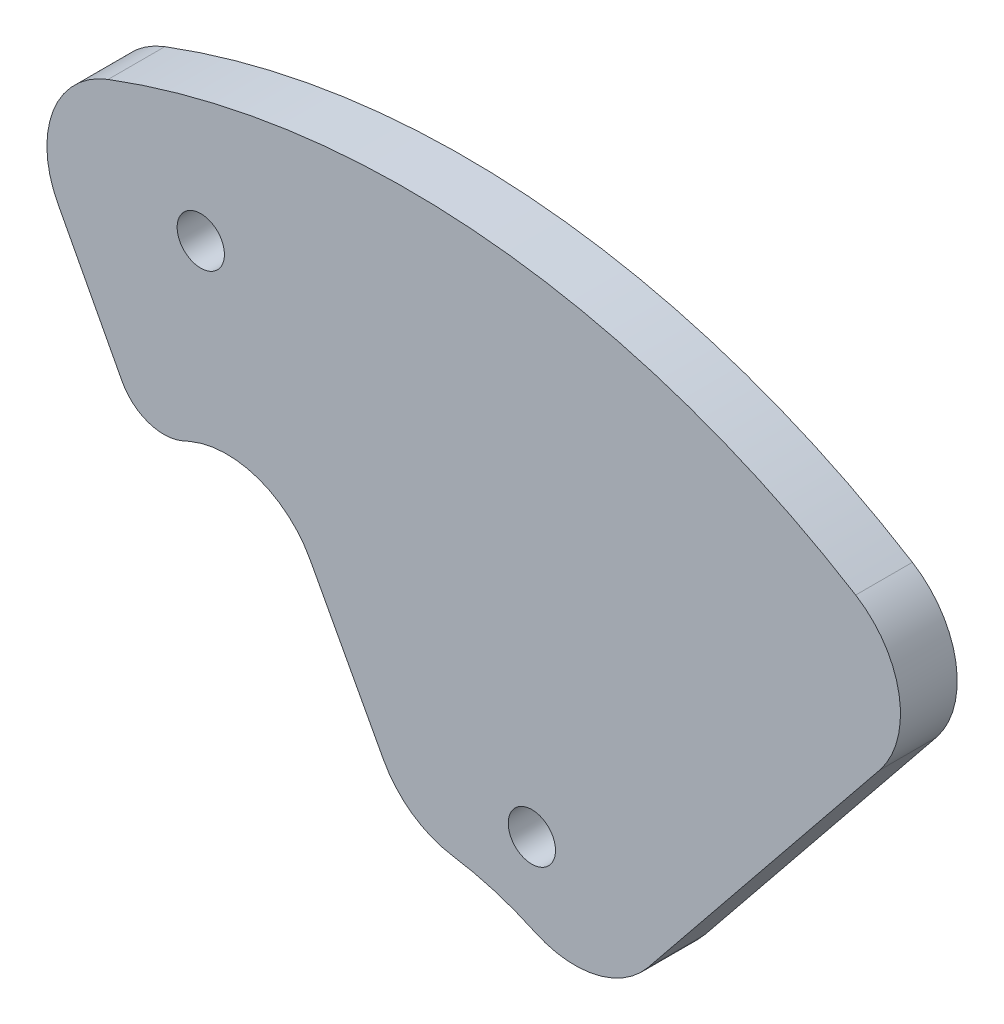
ISO-10303-21;
HEADER;
FILE_DESCRIPTION(('STEP AP214'),'2;1');
FILE_NAME('part.step','',(''),(''),'','','');
FILE_SCHEMA(('AUTOMOTIVE_DESIGN { 1 0 10303 214 1 1 1 1 }'));
ENDSEC;
DATA;
#1=APPLICATION_CONTEXT('core data for automotive mechanical design processes');
#2=APPLICATION_PROTOCOL_DEFINITION('international standard','automotive_design',2000,#1);
#3=PRODUCT_CONTEXT('',#1,'mechanical');
#4=PRODUCT('Part','Part','',(#3));
#5=PRODUCT_RELATED_PRODUCT_CATEGORY('part','',(#4));
#6=PRODUCT_DEFINITION_FORMATION('','',#4);
#7=PRODUCT_DEFINITION_CONTEXT('part definition',#1,'design');
#8=PRODUCT_DEFINITION('design','',#6,#7);
#9=PRODUCT_DEFINITION_SHAPE('','',#8);
#10=(LENGTH_UNIT() NAMED_UNIT(*) SI_UNIT(.MILLI.,.METRE.));
#11=(NAMED_UNIT(*) PLANE_ANGLE_UNIT() SI_UNIT($,.RADIAN.));
#12=(NAMED_UNIT(*) SI_UNIT($,.STERADIAN.) SOLID_ANGLE_UNIT());
#13=UNCERTAINTY_MEASURE_WITH_UNIT(LENGTH_MEASURE(1.E-05),#10,'distance_accuracy_value','');
#14=(GEOMETRIC_REPRESENTATION_CONTEXT(3) GLOBAL_UNCERTAINTY_ASSIGNED_CONTEXT((#13)) GLOBAL_UNIT_ASSIGNED_CONTEXT((#10,
#11,#12)) REPRESENTATION_CONTEXT('',''));
#15=CARTESIAN_POINT('',(0.,0.,0.));
#16=DIRECTION('',(0.,0.,1.));
#17=DIRECTION('',(1.,0.,0.));
#18=AXIS2_PLACEMENT_3D('',#15,#16,#17);
#19=CARTESIAN_POINT('',(42.096669339445,68.0284530951971,6.));
#20=DIRECTION('',(0.,0.,1.));
#21=DIRECTION('',(1.,0.,0.));
#22=AXIS2_PLACEMENT_3D('',#19,#20,#21);
#23=PLANE('',#22);
#24=CARTESIAN_POINT('',(13.1117963041511,37.2603112933648,6.));
#25=DIRECTION('',(0.,0.,1.));
#26=DIRECTION('',(1.,0.,0.));
#27=AXIS2_PLACEMENT_3D('',#24,#25,#26);
#28=CIRCLE('',#27,2.5);
#29=CARTESIAN_POINT('',(15.6117963041511,37.2603112933648,6.));
#30=VERTEX_POINT('',#29);
#31=EDGE_CURVE('E157',#30,#30,#28,.T.);
#32=ORIENTED_EDGE('',*,*,#31,.F.);
#33=EDGE_LOOP('',(#32));
#34=FACE_BOUND('',#33,.T.);
#35=DIRECTION('',(0.628375636537599,0.777910058686714,0.));
#36=VECTOR('',#35,1.);
#37=CARTESIAN_POINT('',(30.097916288786,37.2603112933648,6.));
#38=LINE('',#37,#36);
#39=CARTESIAN_POINT('',(25.4315486694119,31.4834891227238,6.));
#40=VERTEX_POINT('',#39);
#41=CARTESIAN_POINT('',(49.8757699263121,61.7446967298211,6.));
#42=VERTEX_POINT('',#41);
#43=EDGE_CURVE('E50',#40,#42,#38,.T.);
#44=ORIENTED_EDGE('',*,*,#43,.T.);
#45=CARTESIAN_POINT('',(42.096669339445,68.0284530951971,6.));
#46=DIRECTION('',(0.,0.,1.));
#47=DIRECTION('',(1.,0.,0.));
#48=AXIS2_PLACEMENT_3D('',#45,#46,#47);
#49=CIRCLE('',#48,9.99999999999999);
#50=CARTESIAN_POINT('',(47.3587530068756,76.5320097320967,6.));
#51=VERTEX_POINT('',#50);
#52=EDGE_CURVE('E245',#42,#51,#49,.T.);
#53=ORIENTED_EDGE('',*,*,#52,.T.);
#54=CARTESIAN_POINT('',(0.,0.,6.));
#55=DIRECTION('',(0.,0.,1.));
#56=DIRECTION('',(-1.,0.,0.));
#57=AXIS2_PLACEMENT_3D('',#54,#55,#56);
#58=CIRCLE('',#57,90.);
#59=CARTESIAN_POINT('',(-31.6999183212875,84.2325066611679,6.));
#60=VERTEX_POINT('',#59);
#61=EDGE_CURVE('E203',#51,#60,#58,.T.);
#62=ORIENTED_EDGE('',*,*,#61,.T.);
#63=CARTESIAN_POINT('',(-28.1777051744778,74.8733392543715,6.));
#64=DIRECTION('',(0.,0.,1.));
#65=DIRECTION('',(-1.,0.,0.));
#66=AXIS2_PLACEMENT_3D('',#63,#64,#65);
#67=CIRCLE('',#66,9.99999999999999);
#68=CARTESIAN_POINT('',(-37.0231895700033,70.2088558093892,6.));
#69=VERTEX_POINT('',#68);
#70=EDGE_CURVE('E225',#60,#69,#67,.T.);
#71=ORIENTED_EDGE('',*,*,#70,.T.);
#72=DIRECTION('',(0.466448344498234,-0.884548439552553,0.));
#73=VECTOR('',#72,1.);
#74=CARTESIAN_POINT('',(-37.0231895700033,70.2088558093892,6.));
#75=LINE('',#74,#73);
#76=CARTESIAN_POINT('',(-30.2293076989468,57.325290719214,6.));
#77=VERTEX_POINT('',#76);
#78=EDGE_CURVE('E222',#69,#77,#75,.T.);
#79=ORIENTED_EDGE('',*,*,#78,.T.);
#80=CARTESIAN_POINT('',(-25.806565501184,59.6575324417052,6.));
#81=DIRECTION('',(0.,0.,1.));
#82=DIRECTION('',(1.,0.,0.));
#83=AXIS2_PLACEMENT_3D('',#80,#81,#82);
#84=CIRCLE('',#83,5.);
#85=CARTESIAN_POINT('',(-23.821445078016,55.0684914846509,6.));
#86=VERTEX_POINT('',#85);
#87=EDGE_CURVE('E224',#77,#86,#84,.T.);
#88=ORIENTED_EDGE('',*,*,#87,.T.);
#89=CARTESIAN_POINT('',(0.,0.,6.));
#90=DIRECTION('',(0.,0.,-1.));
#91=DIRECTION('',(1.,0.,0.));
#92=AXIS2_PLACEMENT_3D('',#89,#90,#91);
#93=CIRCLE('',#92,60.);
#94=CARTESIAN_POINT('',(-22.9772998706753,55.4260199784638,6.));
#95=VERTEX_POINT('',#94);
#96=EDGE_CURVE('E227',#86,#95,#93,.T.);
#97=ORIENTED_EDGE('',*,*,#96,.T.);
#98=CARTESIAN_POINT('',(-19.1477498922294,46.1883499820531,6.));
#99=DIRECTION('',(0.,0.,-1.));
#100=DIRECTION('',(1.,0.,0.));
#101=AXIS2_PLACEMENT_3D('',#98,#99,#100);
#102=CIRCLE('',#101,10.);
#103=CARTESIAN_POINT('',(-10.3397647443526,50.9232626142758,6.));
#104=VERTEX_POINT('',#103);
#105=EDGE_CURVE('E233',#95,#104,#102,.T.);
#106=ORIENTED_EDGE('',*,*,#105,.T.);
#107=DIRECTION('',(0.473491263222264,-0.880798514787681,0.));
#108=VECTOR('',#107,1.);
#109=CARTESIAN_POINT('',(-2.57876395575697,36.4860839399732,6.));
#110=LINE('',#109,#108);
#111=CARTESIAN_POINT('',(-2.57876395575697,36.4860839399732,6.));
#112=VERTEX_POINT('',#111);
#113=EDGE_CURVE('E134',#104,#112,#110,.T.);
#114=ORIENTED_EDGE('',*,*,#113,.T.);
#115=CARTESIAN_POINT('',(6.22922119211983,41.2209965721958,6.));
#116=DIRECTION('',(0.,0.,1.));
#117=DIRECTION('',(-1.,0.,0.));
#118=AXIS2_PLACEMENT_3D('',#115,#116,#117);
#119=CIRCLE('',#118,10.);
#120=CARTESIAN_POINT('',(4.73500944825975,31.3332601646802,6.));
#121=VERTEX_POINT('',#120);
#122=EDGE_CURVE('E128',#112,#121,#119,.T.);
#123=ORIENTED_EDGE('',*,*,#122,.T.);
#124=CARTESIAN_POINT('',(0.,0.,6.));
#125=DIRECTION('',(0.,0.,-1.));
#126=DIRECTION('',(1.,0.,0.));
#127=AXIS2_PLACEMENT_3D('',#124,#125,#126);
#128=CIRCLE('',#127,31.6890124021346);
#129=CARTESIAN_POINT('',(13.4181313968272,28.7079650417811,6.));
#130=VERTEX_POINT('',#129);
#131=EDGE_CURVE('E132',#121,#130,#128,.T.);
#132=ORIENTED_EDGE('',*,*,#131,.T.);
#133=CARTESIAN_POINT('',(17.6524480825448,37.7672454880998,6.));
#134=DIRECTION('',(0.,0.,1.));
#135=DIRECTION('',(1.,0.,0.));
#136=AXIS2_PLACEMENT_3D('',#133,#134,#135);
#137=CIRCLE('',#136,10.);
#138=EDGE_CURVE('E148',#130,#40,#137,.T.);
#139=ORIENTED_EDGE('',*,*,#138,.T.);
#140=EDGE_LOOP('',(#44,#53,#62,#71,#79,#88,#97,#106,#114,#123,#132,#139));
#141=FACE_BOUND('',#140,.T.);
#142=CARTESIAN_POINT('',(-21.9035047380625,74.3403422119489,6.));
#143=DIRECTION('',(0.,0.,1.));
#144=DIRECTION('',(1.,0.,0.));
#145=AXIS2_PLACEMENT_3D('',#142,#143,#144);
#146=CIRCLE('',#145,2.5);
#147=CARTESIAN_POINT('',(-19.4035047380625,74.3403422119489,6.));
#148=VERTEX_POINT('',#147);
#149=EDGE_CURVE('E252',#148,#148,#146,.T.);
#150=ORIENTED_EDGE('',*,*,#149,.F.);
#151=EDGE_LOOP('',(#150));
#152=FACE_BOUND('',#151,.T.);
#153=ADVANCED_FACE('F33',(#34,#141,#152),#23,.T.);
#154=CARTESIAN_POINT('',(42.096669339445,68.0284530951971,0.));
#155=DIRECTION('',(0.,0.,1.));
#156=DIRECTION('',(1.,0.,0.));
#157=AXIS2_PLACEMENT_3D('',#154,#155,#156);
#158=PLANE('',#157);
#159=CARTESIAN_POINT('',(42.096669339445,68.0284530951971,0.));
#160=DIRECTION('',(0.,0.,1.));
#161=DIRECTION('',(1.,0.,0.));
#162=AXIS2_PLACEMENT_3D('',#159,#160,#161);
#163=CIRCLE('',#162,9.99999999999999);
#164=CARTESIAN_POINT('',(49.8757699263121,61.7446967298211,0.));
#165=VERTEX_POINT('',#164);
#166=CARTESIAN_POINT('',(47.3587530068756,76.5320097320967,0.));
#167=VERTEX_POINT('',#166);
#168=EDGE_CURVE('E154',#165,#167,#163,.T.);
#169=ORIENTED_EDGE('',*,*,#168,.F.);
#170=DIRECTION('',(0.628375636537601,0.777910058686712,0.));
#171=VECTOR('',#170,1.);
#172=CARTESIAN_POINT('',(25.4315486694119,31.4834891227238,0.));
#173=LINE('',#172,#171);
#174=CARTESIAN_POINT('',(25.4315486694119,31.4834891227238,0.));
#175=VERTEX_POINT('',#174);
#176=EDGE_CURVE('E174',#175,#165,#173,.T.);
#177=ORIENTED_EDGE('',*,*,#176,.F.);
#178=CARTESIAN_POINT('',(17.6524480825448,37.7672454880998,0.));
#179=DIRECTION('',(0.,0.,1.));
#180=DIRECTION('',(1.,0.,0.));
#181=AXIS2_PLACEMENT_3D('',#178,#179,#180);
#182=CIRCLE('',#181,10.);
#183=CARTESIAN_POINT('',(13.4181313968272,28.7079650417811,0.));
#184=VERTEX_POINT('',#183);
#185=EDGE_CURVE('E99',#184,#175,#182,.T.);
#186=ORIENTED_EDGE('',*,*,#185,.F.);
#187=CARTESIAN_POINT('',(0.,0.,0.));
#188=DIRECTION('',(0.,0.,-1.));
#189=DIRECTION('',(1.,0.,0.));
#190=AXIS2_PLACEMENT_3D('',#187,#188,#189);
#191=CIRCLE('',#190,31.6890124021346);
#192=CARTESIAN_POINT('',(4.73500944825975,31.3332601646802,0.));
#193=VERTEX_POINT('',#192);
#194=EDGE_CURVE('E92',#193,#184,#191,.T.);
#195=ORIENTED_EDGE('',*,*,#194,.F.);
#196=CARTESIAN_POINT('',(6.22922119211983,41.2209965721958,0.));
#197=DIRECTION('',(0.,0.,1.));
#198=DIRECTION('',(-1.,0.,0.));
#199=AXIS2_PLACEMENT_3D('',#196,#197,#198);
#200=CIRCLE('',#199,10.);
#201=CARTESIAN_POINT('',(-2.57876395575697,36.4860839399732,0.));
#202=VERTEX_POINT('',#201);
#203=EDGE_CURVE('E142',#202,#193,#200,.T.);
#204=ORIENTED_EDGE('',*,*,#203,.F.);
#205=DIRECTION('',(0.473491263222264,-0.880798514787681,0.));
#206=VECTOR('',#205,1.);
#207=CARTESIAN_POINT('',(-2.57876395575697,36.4860839399732,0.));
#208=LINE('',#207,#206);
#209=CARTESIAN_POINT('',(-10.3397647443526,50.9232626142758,0.));
#210=VERTEX_POINT('',#209);
#211=EDGE_CURVE('E169',#210,#202,#208,.T.);
#212=ORIENTED_EDGE('',*,*,#211,.F.);
#213=CARTESIAN_POINT('',(-19.1477498922294,46.1883499820531,0.));
#214=DIRECTION('',(0.,0.,-1.));
#215=DIRECTION('',(1.,0.,0.));
#216=AXIS2_PLACEMENT_3D('',#213,#214,#215);
#217=CIRCLE('',#216,10.);
#218=CARTESIAN_POINT('',(-22.9772998706753,55.4260199784638,0.));
#219=VERTEX_POINT('',#218);
#220=EDGE_CURVE('E167',#219,#210,#217,.T.);
#221=ORIENTED_EDGE('',*,*,#220,.F.);
#222=CARTESIAN_POINT('',(0.,0.,0.));
#223=DIRECTION('',(0.,0.,-1.));
#224=DIRECTION('',(1.,0.,0.));
#225=AXIS2_PLACEMENT_3D('',#222,#223,#224);
#226=CIRCLE('',#225,60.);
#227=CARTESIAN_POINT('',(-23.821445078016,55.0684914846509,0.));
#228=VERTEX_POINT('',#227);
#229=EDGE_CURVE('E165',#228,#219,#226,.T.);
#230=ORIENTED_EDGE('',*,*,#229,.F.);
#231=CARTESIAN_POINT('',(-25.806565501184,59.6575324417052,0.));
#232=DIRECTION('',(0.,0.,1.));
#233=DIRECTION('',(1.,0.,0.));
#234=AXIS2_PLACEMENT_3D('',#231,#232,#233);
#235=CIRCLE('',#234,5.);
#236=CARTESIAN_POINT('',(-30.2293076989468,57.325290719214,0.));
#237=VERTEX_POINT('',#236);
#238=EDGE_CURVE('E163',#237,#228,#235,.T.);
#239=ORIENTED_EDGE('',*,*,#238,.F.);
#240=DIRECTION('',(0.466448344498234,-0.884548439552553,0.));
#241=VECTOR('',#240,1.);
#242=CARTESIAN_POINT('',(-37.0231895700033,70.2088558093892,0.));
#243=LINE('',#242,#241);
#244=CARTESIAN_POINT('',(-37.0231895700033,70.2088558093892,0.));
#245=VERTEX_POINT('',#244);
#246=EDGE_CURVE('E161',#245,#237,#243,.T.);
#247=ORIENTED_EDGE('',*,*,#246,.F.);
#248=CARTESIAN_POINT('',(-28.1777051744778,74.8733392543715,0.));
#249=DIRECTION('',(0.,0.,1.));
#250=DIRECTION('',(-1.,0.,0.));
#251=AXIS2_PLACEMENT_3D('',#248,#249,#250);
#252=CIRCLE('',#251,9.99999999999999);
#253=CARTESIAN_POINT('',(-31.6999183212875,84.2325066611679,0.));
#254=VERTEX_POINT('',#253);
#255=EDGE_CURVE('E159',#254,#245,#252,.T.);
#256=ORIENTED_EDGE('',*,*,#255,.F.);
#257=CARTESIAN_POINT('',(0.,0.,0.));
#258=DIRECTION('',(0.,0.,1.));
#259=DIRECTION('',(-1.,0.,0.));
#260=AXIS2_PLACEMENT_3D('',#257,#258,#259);
#261=CIRCLE('',#260,90.);
#262=EDGE_CURVE('E156',#167,#254,#261,.T.);
#263=ORIENTED_EDGE('',*,*,#262,.F.);
#264=EDGE_LOOP('',(#169,#177,#186,#195,#204,#212,#221,#230,#239,#247,#256,#263));
#265=FACE_BOUND('',#264,.T.);
#266=CARTESIAN_POINT('',(13.1117963041511,37.2603112933648,0.));
#267=DIRECTION('',(0.,0.,1.));
#268=DIRECTION('',(1.,0.,0.));
#269=AXIS2_PLACEMENT_3D('',#266,#267,#268);
#270=CIRCLE('',#269,2.5);
#271=CARTESIAN_POINT('',(15.6117963041511,37.2603112933648,0.));
#272=VERTEX_POINT('',#271);
#273=EDGE_CURVE('E249',#272,#272,#270,.T.);
#274=ORIENTED_EDGE('',*,*,#273,.T.);
#275=EDGE_LOOP('',(#274));
#276=FACE_BOUND('',#275,.T.);
#277=CARTESIAN_POINT('',(-21.9035047380625,74.3403422119489,0.));
#278=DIRECTION('',(0.,0.,1.));
#279=DIRECTION('',(1.,0.,0.));
#280=AXIS2_PLACEMENT_3D('',#277,#278,#279);
#281=CIRCLE('',#280,2.5);
#282=CARTESIAN_POINT('',(-19.4035047380625,74.3403422119489,0.));
#283=VERTEX_POINT('',#282);
#284=EDGE_CURVE('E255',#283,#283,#281,.T.);
#285=ORIENTED_EDGE('',*,*,#284,.T.);
#286=EDGE_LOOP('',(#285));
#287=FACE_BOUND('',#286,.T.);
#288=ADVANCED_FACE('F209',(#265,#276,#287),#158,.F.);
#289=CARTESIAN_POINT('',(42.096669339445,68.0284530951971,6.));
#290=DIRECTION('',(0.,0.,-1.));
#291=DIRECTION('',(-1.,0.,0.));
#292=AXIS2_PLACEMENT_3D('',#289,#290,#291);
#293=CYLINDRICAL_SURFACE('',#292,9.99999999999999);
#294=ORIENTED_EDGE('',*,*,#168,.T.);
#295=DIRECTION('',(0.,0.,-1.));
#296=VECTOR('',#295,1.);
#297=CARTESIAN_POINT('',(47.3587530068756,76.5320097320967,6.));
#298=LINE('',#297,#296);
#299=EDGE_CURVE('E42',#51,#167,#298,.T.);
#300=ORIENTED_EDGE('',*,*,#299,.F.);
#301=ORIENTED_EDGE('',*,*,#52,.F.);
#302=DIRECTION('',(0.,0.,-1.));
#303=VECTOR('',#302,1.);
#304=CARTESIAN_POINT('',(49.8757699263121,61.7446967298211,6.));
#305=LINE('',#304,#303);
#306=EDGE_CURVE('E11',#42,#165,#305,.T.);
#307=ORIENTED_EDGE('',*,*,#306,.T.);
#308=EDGE_LOOP('',(#294,#300,#301,#307));
#309=FACE_BOUND('',#308,.T.);
#310=ADVANCED_FACE('F35',(#309),#293,.T.);
#311=CARTESIAN_POINT('',(0.,0.,6.));
#312=DIRECTION('',(0.,0.,-1.));
#313=DIRECTION('',(-1.,0.,0.));
#314=AXIS2_PLACEMENT_3D('',#311,#312,#313);
#315=CYLINDRICAL_SURFACE('',#314,90.);
#316=ORIENTED_EDGE('',*,*,#262,.T.);
#317=DIRECTION('',(0.,0.,-1.));
#318=VECTOR('',#317,1.);
#319=CARTESIAN_POINT('',(-31.6999183212875,84.2325066611679,6.));
#320=LINE('',#319,#318);
#321=EDGE_CURVE('E194',#60,#254,#320,.T.);
#322=ORIENTED_EDGE('',*,*,#321,.F.);
#323=ORIENTED_EDGE('',*,*,#61,.F.);
#324=ORIENTED_EDGE('',*,*,#299,.T.);
#325=EDGE_LOOP('',(#316,#322,#323,#324));
#326=FACE_BOUND('',#325,.T.);
#327=ADVANCED_FACE('F201',(#326),#315,.T.);
#328=CARTESIAN_POINT('',(-28.1777051744778,74.8733392543715,6.));
#329=DIRECTION('',(0.,0.,-1.));
#330=DIRECTION('',(-1.,0.,0.));
#331=AXIS2_PLACEMENT_3D('',#328,#329,#330);
#332=CYLINDRICAL_SURFACE('',#331,9.99999999999999);
#333=ORIENTED_EDGE('',*,*,#255,.T.);
#334=DIRECTION('',(0.,0.,-1.));
#335=VECTOR('',#334,1.);
#336=CARTESIAN_POINT('',(-37.0231895700033,70.2088558093892,6.));
#337=LINE('',#336,#335);
#338=EDGE_CURVE('E191',#69,#245,#337,.T.);
#339=ORIENTED_EDGE('',*,*,#338,.F.);
#340=ORIENTED_EDGE('',*,*,#70,.F.);
#341=ORIENTED_EDGE('',*,*,#321,.T.);
#342=EDGE_LOOP('',(#333,#339,#340,#341));
#343=FACE_BOUND('',#342,.T.);
#344=ADVANCED_FACE('F216',(#343),#332,.T.);
#345=CARTESIAN_POINT('',(-37.0231895700033,70.2088558093892,6.));
#346=DIRECTION('',(0.884548439552553,0.466448344498234,0.));
#347=DIRECTION('',(-0.466448344498234,0.884548439552553,0.));
#348=AXIS2_PLACEMENT_3D('',#345,#346,#347);
#349=PLANE('',#348);
#350=ORIENTED_EDGE('',*,*,#246,.T.);
#351=DIRECTION('',(0.,0.,-1.));
#352=VECTOR('',#351,1.);
#353=CARTESIAN_POINT('',(-30.2293076989468,57.325290719214,6.));
#354=LINE('',#353,#352);
#355=EDGE_CURVE('E188',#77,#237,#354,.T.);
#356=ORIENTED_EDGE('',*,*,#355,.F.);
#357=ORIENTED_EDGE('',*,*,#78,.F.);
#358=ORIENTED_EDGE('',*,*,#338,.T.);
#359=EDGE_LOOP('',(#350,#356,#357,#358));
#360=FACE_BOUND('',#359,.T.);
#361=ADVANCED_FACE('F220',(#360),#349,.F.);
#362=CARTESIAN_POINT('',(-25.806565501184,59.6575324417052,6.));
#363=DIRECTION('',(0.,0.,-1.));
#364=DIRECTION('',(-1.,0.,0.));
#365=AXIS2_PLACEMENT_3D('',#362,#363,#364);
#366=CYLINDRICAL_SURFACE('',#365,5.);
#367=ORIENTED_EDGE('',*,*,#238,.T.);
#368=DIRECTION('',(0.,0.,-1.));
#369=VECTOR('',#368,1.);
#370=CARTESIAN_POINT('',(-23.821445078016,55.0684914846509,6.));
#371=LINE('',#370,#369);
#372=EDGE_CURVE('E185',#86,#228,#371,.T.);
#373=ORIENTED_EDGE('',*,*,#372,.F.);
#374=ORIENTED_EDGE('',*,*,#87,.F.);
#375=ORIENTED_EDGE('',*,*,#355,.T.);
#376=EDGE_LOOP('',(#367,#373,#374,#375));
#377=FACE_BOUND('',#376,.T.);
#378=ADVANCED_FACE('F291',(#377),#366,.T.);
#379=CARTESIAN_POINT('',(0.,0.,6.));
#380=DIRECTION('',(0.,0.,-1.));
#381=DIRECTION('',(-1.,0.,0.));
#382=AXIS2_PLACEMENT_3D('',#379,#380,#381);
#383=CYLINDRICAL_SURFACE('',#382,60.);
#384=ORIENTED_EDGE('',*,*,#229,.T.);
#385=DIRECTION('',(0.,0.,-1.));
#386=VECTOR('',#385,1.);
#387=CARTESIAN_POINT('',(-22.9772998706753,55.4260199784638,6.));
#388=LINE('',#387,#386);
#389=EDGE_CURVE('E182',#95,#219,#388,.T.);
#390=ORIENTED_EDGE('',*,*,#389,.F.);
#391=ORIENTED_EDGE('',*,*,#96,.F.);
#392=ORIENTED_EDGE('',*,*,#372,.T.);
#393=EDGE_LOOP('',(#384,#390,#391,#392));
#394=FACE_BOUND('',#393,.T.);
#395=ADVANCED_FACE('F288',(#394),#383,.F.);
#396=CARTESIAN_POINT('',(-19.1477498922294,46.1883499820531,6.));
#397=DIRECTION('',(0.,0.,-1.));
#398=DIRECTION('',(-1.,0.,0.));
#399=AXIS2_PLACEMENT_3D('',#396,#397,#398);
#400=CYLINDRICAL_SURFACE('',#399,10.);
#401=ORIENTED_EDGE('',*,*,#220,.T.);
#402=DIRECTION('',(0.,0.,-1.));
#403=VECTOR('',#402,1.);
#404=CARTESIAN_POINT('',(-10.3397647443526,50.9232626142758,6.));
#405=LINE('',#404,#403);
#406=EDGE_CURVE('E179',#104,#210,#405,.T.);
#407=ORIENTED_EDGE('',*,*,#406,.F.);
#408=ORIENTED_EDGE('',*,*,#105,.F.);
#409=ORIENTED_EDGE('',*,*,#389,.T.);
#410=EDGE_LOOP('',(#401,#407,#408,#409));
#411=FACE_BOUND('',#410,.T.);
#412=ADVANCED_FACE('F239',(#411),#400,.F.);
#413=CARTESIAN_POINT('',(-2.57876395575697,36.4860839399732,6.));
#414=DIRECTION('',(0.880798514787681,0.473491263222264,0.));
#415=DIRECTION('',(-0.473491263222264,0.880798514787681,0.));
#416=AXIS2_PLACEMENT_3D('',#413,#414,#415);
#417=PLANE('',#416);
#418=ORIENTED_EDGE('',*,*,#211,.T.);
#419=DIRECTION('',(0.,0.,-1.));
#420=VECTOR('',#419,1.);
#421=CARTESIAN_POINT('',(-2.57876395575697,36.4860839399732,6.));
#422=LINE('',#421,#420);
#423=EDGE_CURVE('E143',#112,#202,#422,.T.);
#424=ORIENTED_EDGE('',*,*,#423,.F.);
#425=ORIENTED_EDGE('',*,*,#113,.F.);
#426=ORIENTED_EDGE('',*,*,#406,.T.);
#427=EDGE_LOOP('',(#418,#424,#425,#426));
#428=FACE_BOUND('',#427,.T.);
#429=ADVANCED_FACE('F243',(#428),#417,.F.);
#430=CARTESIAN_POINT('',(6.22922119211983,41.2209965721958,6.));
#431=DIRECTION('',(0.,0.,-1.));
#432=DIRECTION('',(-1.,0.,0.));
#433=AXIS2_PLACEMENT_3D('',#430,#431,#432);
#434=CYLINDRICAL_SURFACE('',#433,10.);
#435=ORIENTED_EDGE('',*,*,#203,.T.);
#436=DIRECTION('',(0.,0.,-1.));
#437=VECTOR('',#436,1.);
#438=CARTESIAN_POINT('',(4.73500944825975,31.3332601646802,6.));
#439=LINE('',#438,#437);
#440=EDGE_CURVE('E139',#121,#193,#439,.T.);
#441=ORIENTED_EDGE('',*,*,#440,.F.);
#442=ORIENTED_EDGE('',*,*,#122,.F.);
#443=ORIENTED_EDGE('',*,*,#423,.T.);
#444=EDGE_LOOP('',(#435,#441,#442,#443));
#445=FACE_BOUND('',#444,.T.);
#446=ADVANCED_FACE('F140',(#445),#434,.T.);
#447=CARTESIAN_POINT('',(0.,0.,6.));
#448=DIRECTION('',(0.,0.,-1.));
#449=DIRECTION('',(-1.,0.,0.));
#450=AXIS2_PLACEMENT_3D('',#447,#448,#449);
#451=CYLINDRICAL_SURFACE('',#450,31.6890124021346);
#452=ORIENTED_EDGE('',*,*,#194,.T.);
#453=DIRECTION('',(0.,0.,-1.));
#454=VECTOR('',#453,1.);
#455=CARTESIAN_POINT('',(13.4181313968272,28.7079650417811,6.));
#456=LINE('',#455,#454);
#457=EDGE_CURVE('E144',#130,#184,#456,.T.);
#458=ORIENTED_EDGE('',*,*,#457,.F.);
#459=ORIENTED_EDGE('',*,*,#131,.F.);
#460=ORIENTED_EDGE('',*,*,#440,.T.);
#461=EDGE_LOOP('',(#452,#458,#459,#460));
#462=FACE_BOUND('',#461,.T.);
#463=ADVANCED_FACE('F146',(#462),#451,.F.);
#464=CARTESIAN_POINT('',(17.6524480825448,37.7672454880998,6.));
#465=DIRECTION('',(0.,0.,-1.));
#466=DIRECTION('',(-1.,0.,0.));
#467=AXIS2_PLACEMENT_3D('',#464,#465,#466);
#468=CYLINDRICAL_SURFACE('',#467,10.);
#469=ORIENTED_EDGE('',*,*,#185,.T.);
#470=DIRECTION('',(0.,0.,-1.));
#471=VECTOR('',#470,1.);
#472=CARTESIAN_POINT('',(25.4315486694119,31.4834891227238,6.));
#473=LINE('',#472,#471);
#474=EDGE_CURVE('E150',#40,#175,#473,.T.);
#475=ORIENTED_EDGE('',*,*,#474,.F.);
#476=ORIENTED_EDGE('',*,*,#138,.F.);
#477=ORIENTED_EDGE('',*,*,#457,.T.);
#478=EDGE_LOOP('',(#469,#475,#476,#477));
#479=FACE_BOUND('',#478,.T.);
#480=ADVANCED_FACE('F277',(#479),#468,.T.);
#481=CARTESIAN_POINT('',(25.4315486694119,31.4834891227238,6.));
#482=DIRECTION('',(-0.777910058686712,0.628375636537601,0.));
#483=DIRECTION('',(-0.628375636537601,-0.777910058686712,0.));
#484=AXIS2_PLACEMENT_3D('',#481,#482,#483);
#485=PLANE('',#484);
#486=ORIENTED_EDGE('',*,*,#176,.T.);
#487=ORIENTED_EDGE('',*,*,#306,.F.);
#488=ORIENTED_EDGE('',*,*,#43,.F.);
#489=ORIENTED_EDGE('',*,*,#474,.T.);
#490=EDGE_LOOP('',(#486,#487,#488,#489));
#491=FACE_BOUND('',#490,.T.);
#492=ADVANCED_FACE('F244',(#491),#485,.F.);
#493=CARTESIAN_POINT('',(13.1117963041511,37.2603112933648,6.));
#494=DIRECTION('',(0.,0.,-1.));
#495=DIRECTION('',(-1.,0.,0.));
#496=AXIS2_PLACEMENT_3D('',#493,#494,#495);
#497=CYLINDRICAL_SURFACE('',#496,2.5);
#498=ORIENTED_EDGE('',*,*,#31,.T.);
#499=EDGE_LOOP('',(#498));
#500=FACE_BOUND('',#499,.T.);
#501=ORIENTED_EDGE('',*,*,#273,.F.);
#502=EDGE_LOOP('',(#501));
#503=FACE_BOUND('',#502,.T.);
#504=ADVANCED_FACE('F272',(#500,#503),#497,.F.);
#505=CARTESIAN_POINT('',(-21.9035047380625,74.3403422119489,6.));
#506=DIRECTION('',(0.,0.,-1.));
#507=DIRECTION('',(-1.,0.,0.));
#508=AXIS2_PLACEMENT_3D('',#505,#506,#507);
#509=CYLINDRICAL_SURFACE('',#508,2.5);
#510=ORIENTED_EDGE('',*,*,#149,.T.);
#511=EDGE_LOOP('',(#510));
#512=FACE_BOUND('',#511,.T.);
#513=ORIENTED_EDGE('',*,*,#284,.F.);
#514=EDGE_LOOP('',(#513));
#515=FACE_BOUND('',#514,.T.);
#516=ADVANCED_FACE('F261',(#512,#515),#509,.F.);
#517=CLOSED_SHELL('',(#153,#288,#310,#327,#344,#361,#378,#395,#412,#429,#446,#463,#480,#492,
#504,#516));
#518=MANIFOLD_SOLID_BREP('B2',#517);
#519=ADVANCED_BREP_SHAPE_REPRESENTATION('',(#18,#518),#14);
#520=SHAPE_DEFINITION_REPRESENTATION(#9,#519);
ENDSEC;
END-ISO-10303-21;
